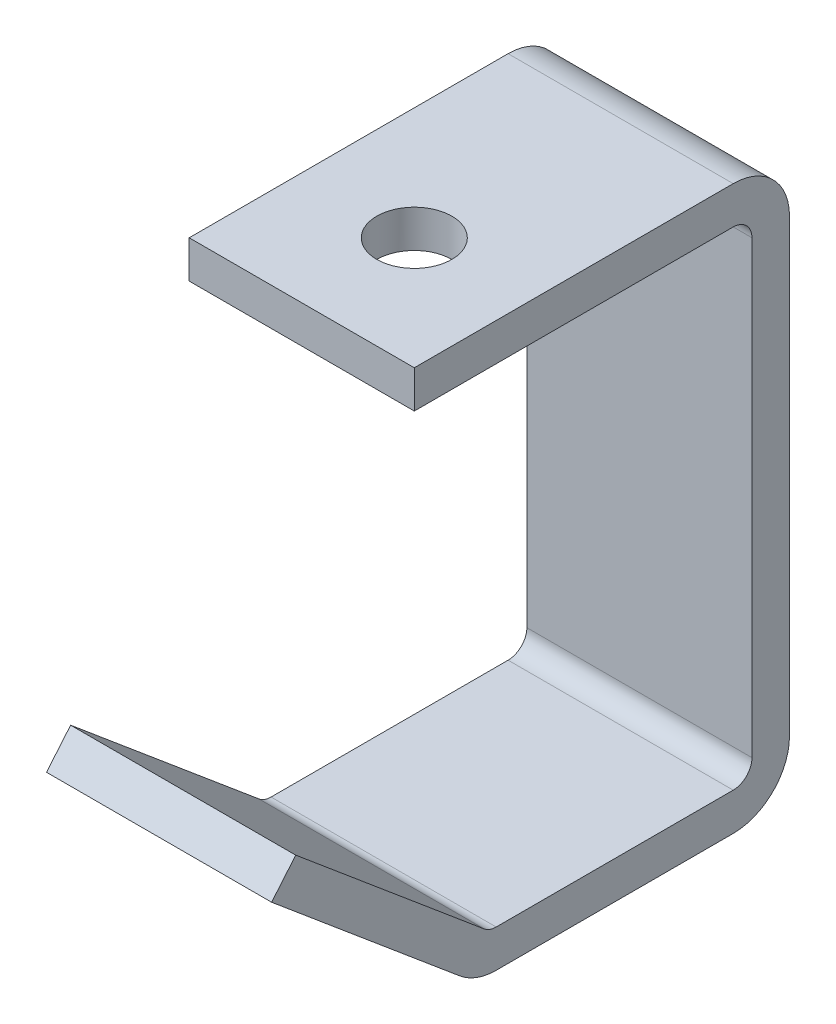
ISO-10303-21;
HEADER;
FILE_DESCRIPTION(('STEP AP214'),'2;1');
FILE_NAME('part.step','',(''),(''),'','','');
FILE_SCHEMA(('AUTOMOTIVE_DESIGN { 1 0 10303 214 1 1 1 1 }'));
ENDSEC;
DATA;
#1=APPLICATION_CONTEXT('core data for automotive mechanical design processes');
#2=APPLICATION_PROTOCOL_DEFINITION('international standard','automotive_design',2000,#1);
#3=PRODUCT_CONTEXT('',#1,'mechanical');
#4=PRODUCT('Part','Part','',(#3));
#5=PRODUCT_RELATED_PRODUCT_CATEGORY('part','',(#4));
#6=PRODUCT_DEFINITION_FORMATION('','',#4);
#7=PRODUCT_DEFINITION_CONTEXT('part definition',#1,'design');
#8=PRODUCT_DEFINITION('design','',#6,#7);
#9=PRODUCT_DEFINITION_SHAPE('','',#8);
#10=(LENGTH_UNIT() NAMED_UNIT(*) SI_UNIT(.MILLI.,.METRE.));
#11=(NAMED_UNIT(*) PLANE_ANGLE_UNIT() SI_UNIT($,.RADIAN.));
#12=(NAMED_UNIT(*) SI_UNIT($,.STERADIAN.) SOLID_ANGLE_UNIT());
#13=UNCERTAINTY_MEASURE_WITH_UNIT(LENGTH_MEASURE(1.E-05),#10,'distance_accuracy_value','');
#14=(GEOMETRIC_REPRESENTATION_CONTEXT(3) GLOBAL_UNCERTAINTY_ASSIGNED_CONTEXT((#13)) GLOBAL_UNIT_ASSIGNED_CONTEXT((#10,
#11,#12)) REPRESENTATION_CONTEXT('',''));
#15=CARTESIAN_POINT('',(0.,0.,0.));
#16=DIRECTION('',(0.,0.,1.));
#17=DIRECTION('',(1.,0.,0.));
#18=AXIS2_PLACEMENT_3D('',#15,#16,#17);
#19=CARTESIAN_POINT('',(19.05,88.9,3.175));
#20=DIRECTION('',(0.,-1.,0.));
#21=DIRECTION('',(0.,0.,-1.));
#22=AXIS2_PLACEMENT_3D('',#19,#20,#21);
#23=PLANE('',#22);
#24=CARTESIAN_POINT('',(0.,88.9,38.1));
#25=DIRECTION('',(0.,1.,0.));
#26=DIRECTION('',(0.,0.,1.));
#27=AXIS2_PLACEMENT_3D('',#24,#25,#26);
#28=CIRCLE('',#27,6.35);
#29=CARTESIAN_POINT('',(0.,88.9,44.45));
#30=VERTEX_POINT('',#29);
#31=EDGE_CURVE('E181',#30,#30,#28,.T.);
#32=ORIENTED_EDGE('',*,*,#31,.F.);
#33=EDGE_LOOP('',(#32));
#34=FACE_BOUND('',#33,.T.);
#35=DIRECTION('',(0.,0.,1.));
#36=VECTOR('',#35,1.);
#37=CARTESIAN_POINT('',(-19.05,88.9,3.175));
#38=LINE('',#37,#36);
#39=CARTESIAN_POINT('',(-19.05,88.9,3.175));
#40=VERTEX_POINT('',#39);
#41=CARTESIAN_POINT('',(-19.05,88.9,57.15));
#42=VERTEX_POINT('',#41);
#43=EDGE_CURVE('E177',#40,#42,#38,.T.);
#44=ORIENTED_EDGE('',*,*,#43,.T.);
#45=DIRECTION('',(-1.,0.,0.));
#46=VECTOR('',#45,1.);
#47=CARTESIAN_POINT('',(19.05,88.9,57.15));
#48=LINE('',#47,#46);
#49=CARTESIAN_POINT('',(19.05,88.9,57.15));
#50=VERTEX_POINT('',#49);
#51=EDGE_CURVE('E11',#50,#42,#48,.T.);
#52=ORIENTED_EDGE('',*,*,#51,.F.);
#53=DIRECTION('',(0.,0.,1.));
#54=VECTOR('',#53,1.);
#55=CARTESIAN_POINT('',(19.05,88.9,3.175));
#56=LINE('',#55,#54);
#57=CARTESIAN_POINT('',(19.05,88.9,3.175));
#58=VERTEX_POINT('',#57);
#59=EDGE_CURVE('E114',#58,#50,#56,.T.);
#60=ORIENTED_EDGE('',*,*,#59,.F.);
#61=DIRECTION('',(-1.,0.,0.));
#62=VECTOR('',#61,1.);
#63=CARTESIAN_POINT('',(19.05,88.9,3.175));
#64=LINE('',#63,#62);
#65=EDGE_CURVE('E173',#58,#40,#64,.T.);
#66=ORIENTED_EDGE('',*,*,#65,.T.);
#67=EDGE_LOOP('',(#44,#52,#60,#66));
#68=FACE_BOUND('',#67,.T.);
#69=ADVANCED_FACE('F34',(#34,#68),#23,.F.);
#70=CARTESIAN_POINT('',(19.05,82.55,57.15));
#71=DIRECTION('',(0.,0.,1.));
#72=DIRECTION('',(1.,0.,0.));
#73=AXIS2_PLACEMENT_3D('',#70,#71,#72);
#74=PLANE('',#73);
#75=DIRECTION('',(0.,1.,0.));
#76=VECTOR('',#75,1.);
#77=CARTESIAN_POINT('',(-19.05,82.55,57.15));
#78=LINE('',#77,#76);
#79=CARTESIAN_POINT('',(-19.05,82.55,57.15));
#80=VERTEX_POINT('',#79);
#81=EDGE_CURVE('E180',#80,#42,#78,.T.);
#82=ORIENTED_EDGE('',*,*,#81,.F.);
#83=DIRECTION('',(-1.,0.,0.));
#84=VECTOR('',#83,1.);
#85=CARTESIAN_POINT('',(19.05,82.55,57.15));
#86=LINE('',#85,#84);
#87=CARTESIAN_POINT('',(19.05,82.55,57.15));
#88=VERTEX_POINT('',#87);
#89=EDGE_CURVE('E42',#88,#80,#86,.T.);
#90=ORIENTED_EDGE('',*,*,#89,.F.);
#91=DIRECTION('',(0.,1.,0.));
#92=VECTOR('',#91,1.);
#93=CARTESIAN_POINT('',(19.05,82.55,57.15));
#94=LINE('',#93,#92);
#95=EDGE_CURVE('E263',#88,#50,#94,.T.);
#96=ORIENTED_EDGE('',*,*,#95,.T.);
#97=ORIENTED_EDGE('',*,*,#51,.T.);
#98=EDGE_LOOP('',(#82,#90,#96,#97));
#99=FACE_BOUND('',#98,.T.);
#100=ADVANCED_FACE('F250',(#99),#74,.T.);
#101=CARTESIAN_POINT('',(19.05,82.55,3.175));
#102=DIRECTION('',(0.,-1.,0.));
#103=DIRECTION('',(0.,0.,-1.));
#104=AXIS2_PLACEMENT_3D('',#101,#102,#103);
#105=PLANE('',#104);
#106=CARTESIAN_POINT('',(0.,82.55,38.1));
#107=DIRECTION('',(0.,-1.,0.));
#108=DIRECTION('',(0.,0.,-1.));
#109=AXIS2_PLACEMENT_3D('',#106,#107,#108);
#110=CIRCLE('',#109,6.35);
#111=CARTESIAN_POINT('',(0.,82.55,31.75));
#112=VERTEX_POINT('',#111);
#113=EDGE_CURVE('E319',#112,#112,#110,.F.);
#114=ORIENTED_EDGE('',*,*,#113,.T.);
#115=EDGE_LOOP('',(#114));
#116=FACE_BOUND('',#115,.T.);
#117=DIRECTION('',(0.,0.,1.));
#118=VECTOR('',#117,1.);
#119=CARTESIAN_POINT('',(-19.05,82.55,3.175));
#120=LINE('',#119,#118);
#121=CARTESIAN_POINT('',(-19.05,82.55,3.175));
#122=VERTEX_POINT('',#121);
#123=EDGE_CURVE('E184',#122,#80,#120,.T.);
#124=ORIENTED_EDGE('',*,*,#123,.F.);
#125=DIRECTION('',(-1.,0.,0.));
#126=VECTOR('',#125,1.);
#127=CARTESIAN_POINT('',(19.05,82.55,3.175));
#128=LINE('',#127,#126);
#129=CARTESIAN_POINT('',(19.05,82.55,3.175));
#130=VERTEX_POINT('',#129);
#131=EDGE_CURVE('E240',#130,#122,#128,.T.);
#132=ORIENTED_EDGE('',*,*,#131,.F.);
#133=DIRECTION('',(0.,0.,1.));
#134=VECTOR('',#133,1.);
#135=CARTESIAN_POINT('',(19.05,82.55,3.175));
#136=LINE('',#135,#134);
#137=EDGE_CURVE('E247',#130,#88,#136,.T.);
#138=ORIENTED_EDGE('',*,*,#137,.T.);
#139=ORIENTED_EDGE('',*,*,#89,.T.);
#140=EDGE_LOOP('',(#124,#132,#138,#139));
#141=FACE_BOUND('',#140,.T.);
#142=ADVANCED_FACE('F245',(#116,#141),#105,.T.);
#143=CARTESIAN_POINT('',(19.05,79.375,3.175));
#144=DIRECTION('',(-1.,0.,0.));
#145=DIRECTION('',(0.,0.,1.));
#146=AXIS2_PLACEMENT_3D('',#143,#144,#145);
#147=CYLINDRICAL_SURFACE('',#146,3.175);
#148=CARTESIAN_POINT('',(-19.05,79.375,3.175));
#149=DIRECTION('',(1.,0.,0.));
#150=DIRECTION('',(0.,0.,-1.));
#151=AXIS2_PLACEMENT_3D('',#148,#149,#150);
#152=CIRCLE('',#151,3.175);
#153=CARTESIAN_POINT('',(-19.05,79.375,0.));
#154=VERTEX_POINT('',#153);
#155=EDGE_CURVE('E187',#154,#122,#152,.T.);
#156=ORIENTED_EDGE('',*,*,#155,.F.);
#157=DIRECTION('',(-1.,0.,0.));
#158=VECTOR('',#157,1.);
#159=CARTESIAN_POINT('',(19.05,79.375,0.));
#160=LINE('',#159,#158);
#161=CARTESIAN_POINT('',(19.05,79.375,0.));
#162=VERTEX_POINT('',#161);
#163=EDGE_CURVE('E238',#162,#154,#160,.T.);
#164=ORIENTED_EDGE('',*,*,#163,.F.);
#165=CARTESIAN_POINT('',(19.05,79.375,3.175));
#166=DIRECTION('',(1.,0.,0.));
#167=DIRECTION('',(0.,0.,-1.));
#168=AXIS2_PLACEMENT_3D('',#165,#166,#167);
#169=CIRCLE('',#168,3.175);
#170=EDGE_CURVE('E260',#162,#130,#169,.T.);
#171=ORIENTED_EDGE('',*,*,#170,.T.);
#172=ORIENTED_EDGE('',*,*,#131,.T.);
#173=EDGE_LOOP('',(#156,#164,#171,#172));
#174=FACE_BOUND('',#173,.T.);
#175=ADVANCED_FACE('F257',(#174),#147,.F.);
#176=CARTESIAN_POINT('',(19.05,3.175,0.));
#177=DIRECTION('',(0.,0.,1.));
#178=DIRECTION('',(1.,0.,0.));
#179=AXIS2_PLACEMENT_3D('',#176,#177,#178);
#180=PLANE('',#179);
#181=DIRECTION('',(0.,1.,0.));
#182=VECTOR('',#181,1.);
#183=CARTESIAN_POINT('',(-19.05,3.175,0.));
#184=LINE('',#183,#182);
#185=CARTESIAN_POINT('',(-19.05,3.175,0.));
#186=VERTEX_POINT('',#185);
#187=EDGE_CURVE('E190',#186,#154,#184,.T.);
#188=ORIENTED_EDGE('',*,*,#187,.F.);
#189=DIRECTION('',(-1.,0.,0.));
#190=VECTOR('',#189,1.);
#191=CARTESIAN_POINT('',(19.05,3.175,0.));
#192=LINE('',#191,#190);
#193=CARTESIAN_POINT('',(19.05,3.175,0.));
#194=VERTEX_POINT('',#193);
#195=EDGE_CURVE('E236',#194,#186,#192,.T.);
#196=ORIENTED_EDGE('',*,*,#195,.F.);
#197=DIRECTION('',(0.,1.,0.));
#198=VECTOR('',#197,1.);
#199=CARTESIAN_POINT('',(19.05,3.175,0.));
#200=LINE('',#199,#198);
#201=EDGE_CURVE('E265',#194,#162,#200,.T.);
#202=ORIENTED_EDGE('',*,*,#201,.T.);
#203=ORIENTED_EDGE('',*,*,#163,.T.);
#204=EDGE_LOOP('',(#188,#196,#202,#203));
#205=FACE_BOUND('',#204,.T.);
#206=ADVANCED_FACE('F432',(#205),#180,.T.);
#207=CARTESIAN_POINT('',(19.05,3.175,3.175));
#208=DIRECTION('',(-1.,0.,0.));
#209=DIRECTION('',(0.,0.,1.));
#210=AXIS2_PLACEMENT_3D('',#207,#208,#209);
#211=CYLINDRICAL_SURFACE('',#210,3.175);
#212=CARTESIAN_POINT('',(-19.05,3.175,3.175));
#213=DIRECTION('',(1.,0.,0.));
#214=DIRECTION('',(0.,0.,1.));
#215=AXIS2_PLACEMENT_3D('',#212,#213,#214);
#216=CIRCLE('',#215,3.175);
#217=CARTESIAN_POINT('',(-19.05,0.,3.175));
#218=VERTEX_POINT('',#217);
#219=EDGE_CURVE('E193',#218,#186,#216,.T.);
#220=ORIENTED_EDGE('',*,*,#219,.F.);
#221=DIRECTION('',(-1.,0.,0.));
#222=VECTOR('',#221,1.);
#223=CARTESIAN_POINT('',(19.05,0.,3.175));
#224=LINE('',#223,#222);
#225=CARTESIAN_POINT('',(19.05,0.,3.175));
#226=VERTEX_POINT('',#225);
#227=EDGE_CURVE('E234',#226,#218,#224,.T.);
#228=ORIENTED_EDGE('',*,*,#227,.F.);
#229=CARTESIAN_POINT('',(19.05,3.175,3.175));
#230=DIRECTION('',(1.,0.,0.));
#231=DIRECTION('',(0.,0.,1.));
#232=AXIS2_PLACEMENT_3D('',#229,#230,#231);
#233=CIRCLE('',#232,3.175);
#234=EDGE_CURVE('E271',#226,#194,#233,.T.);
#235=ORIENTED_EDGE('',*,*,#234,.T.);
#236=ORIENTED_EDGE('',*,*,#195,.T.);
#237=EDGE_LOOP('',(#220,#228,#235,#236));
#238=FACE_BOUND('',#237,.T.);
#239=ADVANCED_FACE('F422',(#238),#211,.F.);
#240=CARTESIAN_POINT('',(19.05,0.,43.2943945062048));
#241=DIRECTION('',(0.,1.,0.));
#242=DIRECTION('',(0.,0.,1.));
#243=AXIS2_PLACEMENT_3D('',#240,#241,#242);
#244=PLANE('',#243);
#245=DIRECTION('',(0.,0.,-1.));
#246=VECTOR('',#245,1.);
#247=CARTESIAN_POINT('',(-19.05,0.,43.2943945062048));
#248=LINE('',#247,#246);
#249=CARTESIAN_POINT('',(-19.05,0.,43.2943945062048));
#250=VERTEX_POINT('',#249);
#251=EDGE_CURVE('E196',#250,#218,#248,.T.);
#252=ORIENTED_EDGE('',*,*,#251,.F.);
#253=DIRECTION('',(-1.,0.,0.));
#254=VECTOR('',#253,1.);
#255=CARTESIAN_POINT('',(19.05,0.,43.2943945062048));
#256=LINE('',#255,#254);
#257=CARTESIAN_POINT('',(19.05,0.,43.2943945062048));
#258=VERTEX_POINT('',#257);
#259=EDGE_CURVE('E232',#258,#250,#256,.T.);
#260=ORIENTED_EDGE('',*,*,#259,.F.);
#261=DIRECTION('',(0.,0.,-1.));
#262=VECTOR('',#261,1.);
#263=CARTESIAN_POINT('',(19.05,0.,43.2943945062048));
#264=LINE('',#263,#262);
#265=EDGE_CURVE('E274',#258,#226,#264,.T.);
#266=ORIENTED_EDGE('',*,*,#265,.T.);
#267=ORIENTED_EDGE('',*,*,#227,.T.);
#268=EDGE_LOOP('',(#252,#260,#266,#267));
#269=FACE_BOUND('',#268,.T.);
#270=ADVANCED_FACE('F412',(#269),#244,.T.);
#271=CARTESIAN_POINT('',(19.05,3.175,43.2943945062048));
#272=DIRECTION('',(-1.,0.,0.));
#273=DIRECTION('',(0.,0.,1.));
#274=AXIS2_PLACEMENT_3D('',#271,#272,#273);
#275=CYLINDRICAL_SURFACE('',#274,3.175);
#276=CARTESIAN_POINT('',(-19.05,3.175,43.2943945062048));
#277=DIRECTION('',(1.,0.,0.));
#278=DIRECTION('',(0.,0.,-1.));
#279=AXIS2_PLACEMENT_3D('',#276,#277,#278);
#280=CIRCLE('',#279,3.175);
#281=CARTESIAN_POINT('',(-19.05,0.742808893097251,45.3352451669596));
#282=VERTEX_POINT('',#281);
#283=EDGE_CURVE('E199',#282,#250,#280,.T.);
#284=ORIENTED_EDGE('',*,*,#283,.F.);
#285=DIRECTION('',(-1.,0.,0.));
#286=VECTOR('',#285,1.);
#287=CARTESIAN_POINT('',(19.05,0.742808893097251,45.3352451669596));
#288=LINE('',#287,#286);
#289=CARTESIAN_POINT('',(19.05,0.742808893097251,45.3352451669596));
#290=VERTEX_POINT('',#289);
#291=EDGE_CURVE('E230',#290,#282,#288,.T.);
#292=ORIENTED_EDGE('',*,*,#291,.F.);
#293=CARTESIAN_POINT('',(19.05,3.175,43.2943945062048));
#294=DIRECTION('',(1.,0.,0.));
#295=DIRECTION('',(0.,0.,-1.));
#296=AXIS2_PLACEMENT_3D('',#293,#294,#295);
#297=CIRCLE('',#296,3.175);
#298=EDGE_CURVE('E277',#290,#258,#297,.T.);
#299=ORIENTED_EDGE('',*,*,#298,.T.);
#300=ORIENTED_EDGE('',*,*,#259,.T.);
#301=EDGE_LOOP('',(#284,#292,#299,#300));
#302=FACE_BOUND('',#301,.T.);
#303=ADVANCED_FACE('F402',(#302),#275,.F.);
#304=CARTESIAN_POINT('',(19.05,27.4943401016882,77.2164785921939));
#305=DIRECTION('',(0.,0.766044443118977,-0.64278760968654));
#306=DIRECTION('',(0.,0.64278760968654,0.766044443118977));
#307=AXIS2_PLACEMENT_3D('',#304,#305,#306);
#308=PLANE('',#307);
#309=DIRECTION('',(0.,-0.64278760968654,-0.766044443118977));
#310=VECTOR('',#309,1.);
#311=CARTESIAN_POINT('',(-19.05,27.4943401016882,77.2164785921939));
#312=LINE('',#311,#310);
#313=CARTESIAN_POINT('',(-19.05,27.4943401016882,77.2164785921939));
#314=VERTEX_POINT('',#313);
#315=EDGE_CURVE('E202',#314,#282,#312,.T.);
#316=ORIENTED_EDGE('',*,*,#315,.F.);
#317=DIRECTION('',(-1.,0.,0.));
#318=VECTOR('',#317,1.);
#319=CARTESIAN_POINT('',(19.05,27.4943401016882,77.2164785921939));
#320=LINE('',#319,#318);
#321=CARTESIAN_POINT('',(19.05,27.4943401016882,77.2164785921939));
#322=VERTEX_POINT('',#321);
#323=EDGE_CURVE('E228',#322,#314,#320,.T.);
#324=ORIENTED_EDGE('',*,*,#323,.F.);
#325=DIRECTION('',(0.,-0.64278760968654,-0.766044443118977));
#326=VECTOR('',#325,1.);
#327=CARTESIAN_POINT('',(19.05,27.4943401016882,77.2164785921939));
#328=LINE('',#327,#326);
#329=EDGE_CURVE('E280',#322,#290,#328,.T.);
#330=ORIENTED_EDGE('',*,*,#329,.T.);
#331=ORIENTED_EDGE('',*,*,#291,.T.);
#332=EDGE_LOOP('',(#316,#324,#330,#331));
#333=FACE_BOUND('',#332,.T.);
#334=ADVANCED_FACE('F392',(#333),#308,.T.);
#335=CARTESIAN_POINT('',(19.05,22.6299578878827,81.2981799137034));
#336=DIRECTION('',(0.,0.642787609686541,0.766044443118977));
#337=DIRECTION('',(0.,-0.766044443118977,0.642787609686541));
#338=AXIS2_PLACEMENT_3D('',#335,#336,#337);
#339=PLANE('',#338);
#340=DIRECTION('',(0.,0.766044443118977,-0.642787609686541));
#341=VECTOR('',#340,1.);
#342=CARTESIAN_POINT('',(-19.05,22.6299578878827,81.2981799137034));
#343=LINE('',#342,#341);
#344=CARTESIAN_POINT('',(-19.05,22.6299578878827,81.2981799137034));
#345=VERTEX_POINT('',#344);
#346=EDGE_CURVE('E205',#345,#314,#343,.T.);
#347=ORIENTED_EDGE('',*,*,#346,.F.);
#348=DIRECTION('',(-1.,0.,0.));
#349=VECTOR('',#348,1.);
#350=CARTESIAN_POINT('',(19.05,22.6299578878827,81.2981799137034));
#351=LINE('',#350,#349);
#352=CARTESIAN_POINT('',(19.05,22.6299578878827,81.2981799137034));
#353=VERTEX_POINT('',#352);
#354=EDGE_CURVE('E226',#353,#345,#351,.T.);
#355=ORIENTED_EDGE('',*,*,#354,.F.);
#356=DIRECTION('',(0.,0.766044443118977,-0.642787609686541));
#357=VECTOR('',#356,1.);
#358=CARTESIAN_POINT('',(19.05,22.6299578878827,81.2981799137034));
#359=LINE('',#358,#357);
#360=EDGE_CURVE('E283',#353,#322,#359,.T.);
#361=ORIENTED_EDGE('',*,*,#360,.T.);
#362=ORIENTED_EDGE('',*,*,#323,.T.);
#363=EDGE_LOOP('',(#347,#355,#361,#362));
#364=FACE_BOUND('',#363,.T.);
#365=ADVANCED_FACE('F382',(#364),#339,.T.);
#366=CARTESIAN_POINT('',(19.05,22.6299578878827,81.2981799137034));
#367=DIRECTION('',(0.,0.766044443118977,-0.64278760968654));
#368=DIRECTION('',(0.,0.64278760968654,0.766044443118977));
#369=AXIS2_PLACEMENT_3D('',#366,#367,#368);
#370=PLANE('',#369);
#371=DIRECTION('',(0.,-0.64278760968654,-0.766044443118977));
#372=VECTOR('',#371,1.);
#373=CARTESIAN_POINT('',(-19.05,22.6299578878827,81.2981799137034));
#374=LINE('',#373,#372);
#375=CARTESIAN_POINT('',(-19.05,-4.12157332070825,49.4169464884691));
#376=VERTEX_POINT('',#375);
#377=EDGE_CURVE('E208',#345,#376,#374,.T.);
#378=ORIENTED_EDGE('',*,*,#377,.T.);
#379=DIRECTION('',(-1.,0.,0.));
#380=VECTOR('',#379,1.);
#381=CARTESIAN_POINT('',(19.05,-4.12157332070825,49.4169464884691));
#382=LINE('',#381,#380);
#383=CARTESIAN_POINT('',(19.05,-4.12157332070825,49.4169464884691));
#384=VERTEX_POINT('',#383);
#385=EDGE_CURVE('E223',#384,#376,#382,.T.);
#386=ORIENTED_EDGE('',*,*,#385,.F.);
#387=DIRECTION('',(0.,-0.64278760968654,-0.766044443118977));
#388=VECTOR('',#387,1.);
#389=CARTESIAN_POINT('',(19.05,22.6299578878827,81.2981799137034));
#390=LINE('',#389,#388);
#391=EDGE_CURVE('E286',#353,#384,#390,.T.);
#392=ORIENTED_EDGE('',*,*,#391,.F.);
#393=ORIENTED_EDGE('',*,*,#354,.T.);
#394=EDGE_LOOP('',(#378,#386,#392,#393));
#395=FACE_BOUND('',#394,.T.);
#396=ADVANCED_FACE('F373',(#395),#370,.F.);
#397=CARTESIAN_POINT('',(19.05,3.175,43.2943945062048));
#398=DIRECTION('',(-1.,0.,0.));
#399=DIRECTION('',(0.,0.,1.));
#400=AXIS2_PLACEMENT_3D('',#397,#398,#399);
#401=CYLINDRICAL_SURFACE('',#400,9.525);
#402=CARTESIAN_POINT('',(-19.05,3.175,43.2943945062048));
#403=DIRECTION('',(1.,0.,0.));
#404=DIRECTION('',(0.,0.,-1.));
#405=AXIS2_PLACEMENT_3D('',#402,#403,#404);
#406=CIRCLE('',#405,9.525);
#407=CARTESIAN_POINT('',(-19.05,-6.35,43.2943945062048));
#408=VERTEX_POINT('',#407);
#409=EDGE_CURVE('E210',#376,#408,#406,.T.);
#410=ORIENTED_EDGE('',*,*,#409,.T.);
#411=DIRECTION('',(-1.,0.,0.));
#412=VECTOR('',#411,1.);
#413=CARTESIAN_POINT('',(19.05,-6.35,43.2943945062048));
#414=LINE('',#413,#412);
#415=CARTESIAN_POINT('',(19.05,-6.35,43.2943945062048));
#416=VERTEX_POINT('',#415);
#417=EDGE_CURVE('E220',#416,#408,#414,.T.);
#418=ORIENTED_EDGE('',*,*,#417,.F.);
#419=CARTESIAN_POINT('',(19.05,3.175,43.2943945062048));
#420=DIRECTION('',(1.,0.,0.));
#421=DIRECTION('',(0.,0.,-1.));
#422=AXIS2_PLACEMENT_3D('',#419,#420,#421);
#423=CIRCLE('',#422,9.525);
#424=EDGE_CURVE('E288',#384,#416,#423,.T.);
#425=ORIENTED_EDGE('',*,*,#424,.F.);
#426=ORIENTED_EDGE('',*,*,#385,.T.);
#427=EDGE_LOOP('',(#410,#418,#425,#426));
#428=FACE_BOUND('',#427,.T.);
#429=ADVANCED_FACE('F295',(#428),#401,.T.);
#430=CARTESIAN_POINT('',(19.05,-6.35,43.2943945062048));
#431=DIRECTION('',(0.,1.,0.));
#432=DIRECTION('',(0.,0.,1.));
#433=AXIS2_PLACEMENT_3D('',#430,#431,#432);
#434=PLANE('',#433);
#435=DIRECTION('',(0.,0.,-1.));
#436=VECTOR('',#435,1.);
#437=CARTESIAN_POINT('',(-19.05,-6.35,43.2943945062048));
#438=LINE('',#437,#436);
#439=CARTESIAN_POINT('',(-19.05,-6.35,3.17499999999999));
#440=VERTEX_POINT('',#439);
#441=EDGE_CURVE('E212',#408,#440,#438,.T.);
#442=ORIENTED_EDGE('',*,*,#441,.T.);
#443=DIRECTION('',(-1.,0.,0.));
#444=VECTOR('',#443,1.);
#445=CARTESIAN_POINT('',(19.05,-6.35,3.17499999999999));
#446=LINE('',#445,#444);
#447=CARTESIAN_POINT('',(19.05,-6.35,3.17499999999999));
#448=VERTEX_POINT('',#447);
#449=EDGE_CURVE('E168',#448,#440,#446,.T.);
#450=ORIENTED_EDGE('',*,*,#449,.F.);
#451=DIRECTION('',(0.,0.,-1.));
#452=VECTOR('',#451,1.);
#453=CARTESIAN_POINT('',(19.05,-6.35,43.2943945062048));
#454=LINE('',#453,#452);
#455=EDGE_CURVE('E159',#416,#448,#454,.T.);
#456=ORIENTED_EDGE('',*,*,#455,.F.);
#457=ORIENTED_EDGE('',*,*,#417,.T.);
#458=EDGE_LOOP('',(#442,#450,#456,#457));
#459=FACE_BOUND('',#458,.T.);
#460=ADVANCED_FACE('F299',(#459),#434,.F.);
#461=CARTESIAN_POINT('',(19.05,3.175,3.175));
#462=DIRECTION('',(-1.,0.,0.));
#463=DIRECTION('',(0.,0.,1.));
#464=AXIS2_PLACEMENT_3D('',#461,#462,#463);
#465=CYLINDRICAL_SURFACE('',#464,9.525);
#466=CARTESIAN_POINT('',(-19.05,3.175,3.175));
#467=DIRECTION('',(1.,0.,0.));
#468=DIRECTION('',(0.,0.,-1.));
#469=AXIS2_PLACEMENT_3D('',#466,#467,#468);
#470=CIRCLE('',#469,9.525);
#471=CARTESIAN_POINT('',(-19.05,3.175,-6.35));
#472=VERTEX_POINT('',#471);
#473=EDGE_CURVE('E167',#440,#472,#470,.T.);
#474=ORIENTED_EDGE('',*,*,#473,.T.);
#475=DIRECTION('',(-1.,0.,0.));
#476=VECTOR('',#475,1.);
#477=CARTESIAN_POINT('',(19.05,3.175,-6.35));
#478=LINE('',#477,#476);
#479=CARTESIAN_POINT('',(19.05,3.175,-6.35));
#480=VERTEX_POINT('',#479);
#481=EDGE_CURVE('E164',#480,#472,#478,.T.);
#482=ORIENTED_EDGE('',*,*,#481,.F.);
#483=CARTESIAN_POINT('',(19.05,3.175,3.175));
#484=DIRECTION('',(1.,0.,0.));
#485=DIRECTION('',(0.,0.,-1.));
#486=AXIS2_PLACEMENT_3D('',#483,#484,#485);
#487=CIRCLE('',#486,9.525);
#488=EDGE_CURVE('E153',#448,#480,#487,.T.);
#489=ORIENTED_EDGE('',*,*,#488,.F.);
#490=ORIENTED_EDGE('',*,*,#449,.T.);
#491=EDGE_LOOP('',(#474,#482,#489,#490));
#492=FACE_BOUND('',#491,.T.);
#493=ADVANCED_FACE('F165',(#492),#465,.T.);
#494=CARTESIAN_POINT('',(19.05,3.175,-6.35));
#495=DIRECTION('',(0.,0.,1.));
#496=DIRECTION('',(1.,0.,0.));
#497=AXIS2_PLACEMENT_3D('',#494,#495,#496);
#498=PLANE('',#497);
#499=DIRECTION('',(0.,1.,0.));
#500=VECTOR('',#499,1.);
#501=CARTESIAN_POINT('',(-19.05,3.175,-6.35));
#502=LINE('',#501,#500);
#503=CARTESIAN_POINT('',(-19.05,79.375,-6.35));
#504=VERTEX_POINT('',#503);
#505=EDGE_CURVE('E102',#472,#504,#502,.T.);
#506=ORIENTED_EDGE('',*,*,#505,.T.);
#507=DIRECTION('',(-1.,0.,0.));
#508=VECTOR('',#507,1.);
#509=CARTESIAN_POINT('',(19.05,79.375,-6.35));
#510=LINE('',#509,#508);
#511=CARTESIAN_POINT('',(19.05,79.375,-6.35));
#512=VERTEX_POINT('',#511);
#513=EDGE_CURVE('E169',#512,#504,#510,.T.);
#514=ORIENTED_EDGE('',*,*,#513,.F.);
#515=DIRECTION('',(0.,1.,0.));
#516=VECTOR('',#515,1.);
#517=CARTESIAN_POINT('',(19.05,3.175,-6.35));
#518=LINE('',#517,#516);
#519=EDGE_CURVE('E157',#480,#512,#518,.T.);
#520=ORIENTED_EDGE('',*,*,#519,.F.);
#521=ORIENTED_EDGE('',*,*,#481,.T.);
#522=EDGE_LOOP('',(#506,#514,#520,#521));
#523=FACE_BOUND('',#522,.T.);
#524=ADVANCED_FACE('F171',(#523),#498,.F.);
#525=CARTESIAN_POINT('',(19.05,79.375,3.175));
#526=DIRECTION('',(-1.,0.,0.));
#527=DIRECTION('',(0.,0.,1.));
#528=AXIS2_PLACEMENT_3D('',#525,#526,#527);
#529=CYLINDRICAL_SURFACE('',#528,9.525);
#530=CARTESIAN_POINT('',(-19.05,79.375,3.175));
#531=DIRECTION('',(1.,0.,0.));
#532=DIRECTION('',(0.,0.,-1.));
#533=AXIS2_PLACEMENT_3D('',#530,#531,#532);
#534=CIRCLE('',#533,9.525);
#535=EDGE_CURVE('E108',#504,#40,#534,.T.);
#536=ORIENTED_EDGE('',*,*,#535,.T.);
#537=ORIENTED_EDGE('',*,*,#65,.F.);
#538=CARTESIAN_POINT('',(19.05,79.375,3.175));
#539=DIRECTION('',(1.,0.,0.));
#540=DIRECTION('',(0.,0.,-1.));
#541=AXIS2_PLACEMENT_3D('',#538,#539,#540);
#542=CIRCLE('',#541,9.525);
#543=EDGE_CURVE('E50',#512,#58,#542,.T.);
#544=ORIENTED_EDGE('',*,*,#543,.F.);
#545=ORIENTED_EDGE('',*,*,#513,.T.);
#546=EDGE_LOOP('',(#536,#537,#544,#545));
#547=FACE_BOUND('',#546,.T.);
#548=ADVANCED_FACE('F301',(#547),#529,.T.);
#549=CARTESIAN_POINT('',(19.05,79.375,3.175));
#550=DIRECTION('',(1.,0.,0.));
#551=DIRECTION('',(0.,0.,-1.));
#552=AXIS2_PLACEMENT_3D('',#549,#550,#551);
#553=PLANE('',#552);
#554=ORIENTED_EDGE('',*,*,#59,.T.);
#555=ORIENTED_EDGE('',*,*,#95,.F.);
#556=ORIENTED_EDGE('',*,*,#137,.F.);
#557=ORIENTED_EDGE('',*,*,#170,.F.);
#558=ORIENTED_EDGE('',*,*,#201,.F.);
#559=ORIENTED_EDGE('',*,*,#234,.F.);
#560=ORIENTED_EDGE('',*,*,#265,.F.);
#561=ORIENTED_EDGE('',*,*,#298,.F.);
#562=ORIENTED_EDGE('',*,*,#329,.F.);
#563=ORIENTED_EDGE('',*,*,#360,.F.);
#564=ORIENTED_EDGE('',*,*,#391,.T.);
#565=ORIENTED_EDGE('',*,*,#424,.T.);
#566=ORIENTED_EDGE('',*,*,#455,.T.);
#567=ORIENTED_EDGE('',*,*,#488,.T.);
#568=ORIENTED_EDGE('',*,*,#519,.T.);
#569=ORIENTED_EDGE('',*,*,#543,.T.);
#570=EDGE_LOOP('',(#554,#555,#556,#557,#558,#559,#560,#561,#562,#563,#564,#565,#566,#567,#568,#569));
#571=FACE_BOUND('',#570,.T.);
#572=ADVANCED_FACE('F155',(#571),#553,.T.);
#573=CARTESIAN_POINT('',(-19.05,79.375,3.175));
#574=DIRECTION('',(1.,0.,0.));
#575=DIRECTION('',(0.,0.,-1.));
#576=AXIS2_PLACEMENT_3D('',#573,#574,#575);
#577=PLANE('',#576);
#578=ORIENTED_EDGE('',*,*,#43,.F.);
#579=ORIENTED_EDGE('',*,*,#535,.F.);
#580=ORIENTED_EDGE('',*,*,#505,.F.);
#581=ORIENTED_EDGE('',*,*,#473,.F.);
#582=ORIENTED_EDGE('',*,*,#441,.F.);
#583=ORIENTED_EDGE('',*,*,#409,.F.);
#584=ORIENTED_EDGE('',*,*,#377,.F.);
#585=ORIENTED_EDGE('',*,*,#346,.T.);
#586=ORIENTED_EDGE('',*,*,#315,.T.);
#587=ORIENTED_EDGE('',*,*,#283,.T.);
#588=ORIENTED_EDGE('',*,*,#251,.T.);
#589=ORIENTED_EDGE('',*,*,#219,.T.);
#590=ORIENTED_EDGE('',*,*,#187,.T.);
#591=ORIENTED_EDGE('',*,*,#155,.T.);
#592=ORIENTED_EDGE('',*,*,#123,.T.);
#593=ORIENTED_EDGE('',*,*,#81,.T.);
#594=EDGE_LOOP('',(#578,#579,#580,#581,#582,#583,#584,#585,#586,#587,#588,#589,#590,#591,#592,#593));
#595=FACE_BOUND('',#594,.T.);
#596=ADVANCED_FACE('F253',(#595),#577,.F.);
#597=CARTESIAN_POINT('',(0.,-6.35100000000001,38.1000000000001));
#598=DIRECTION('',(0.,1.,0.));
#599=DIRECTION('',(0.,0.,1.));
#600=AXIS2_PLACEMENT_3D('',#597,#598,#599);
#601=CYLINDRICAL_SURFACE('',#600,6.35);
#602=ORIENTED_EDGE('',*,*,#113,.F.);
#603=EDGE_LOOP('',(#602));
#604=FACE_BOUND('',#603,.T.);
#605=ORIENTED_EDGE('',*,*,#31,.T.);
#606=EDGE_LOOP('',(#605));
#607=FACE_BOUND('',#606,.T.);
#608=ADVANCED_FACE('F326',(#604,#607),#601,.F.);
#609=CLOSED_SHELL('',(#69,#100,#142,#175,#206,#239,#270,#303,#334,#365,#396,#429,#460,#493,#524,
#548,#572,#596,#608));
#610=MANIFOLD_SOLID_BREP('B2',#609);
#611=ADVANCED_BREP_SHAPE_REPRESENTATION('',(#18,#610),#14);
#612=SHAPE_DEFINITION_REPRESENTATION(#9,#611);
ENDSEC;
END-ISO-10303-21;
